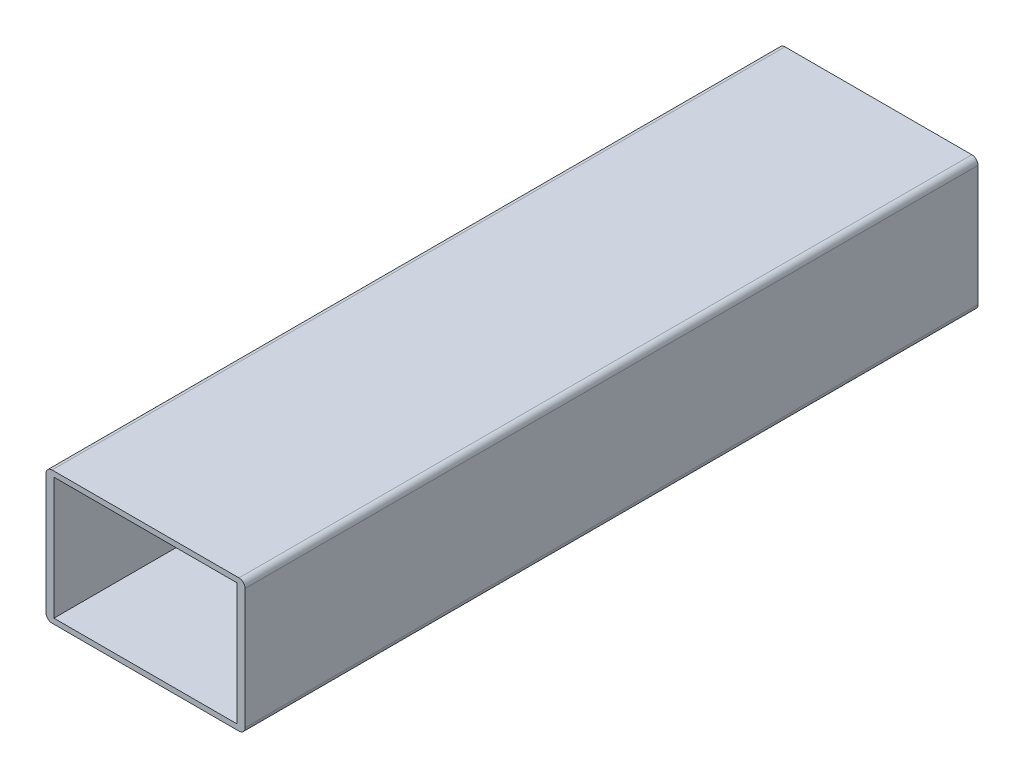
ISO-10303-21;
HEADER;
FILE_DESCRIPTION(('STEP AP214'),'2;1');
FILE_NAME('part.step','',(''),(''),'','','');
FILE_SCHEMA(('AUTOMOTIVE_DESIGN { 1 0 10303 214 1 1 1 1 }'));
ENDSEC;
DATA;
#1=APPLICATION_CONTEXT('core data for automotive mechanical design processes');
#2=APPLICATION_PROTOCOL_DEFINITION('international standard','automotive_design',2000,#1);
#3=PRODUCT_CONTEXT('',#1,'mechanical');
#4=PRODUCT('Part','Part','',(#3));
#5=PRODUCT_RELATED_PRODUCT_CATEGORY('part','',(#4));
#6=PRODUCT_DEFINITION_FORMATION('','',#4);
#7=PRODUCT_DEFINITION_CONTEXT('part definition',#1,'design');
#8=PRODUCT_DEFINITION('design','',#6,#7);
#9=PRODUCT_DEFINITION_SHAPE('','',#8);
#10=(LENGTH_UNIT() NAMED_UNIT(*) SI_UNIT(.MILLI.,.METRE.));
#11=(NAMED_UNIT(*) PLANE_ANGLE_UNIT() SI_UNIT($,.RADIAN.));
#12=(NAMED_UNIT(*) SI_UNIT($,.STERADIAN.) SOLID_ANGLE_UNIT());
#13=UNCERTAINTY_MEASURE_WITH_UNIT(LENGTH_MEASURE(1.E-05),#10,'distance_accuracy_value','');
#14=(GEOMETRIC_REPRESENTATION_CONTEXT(3) GLOBAL_UNCERTAINTY_ASSIGNED_CONTEXT((#13)) GLOBAL_UNIT_ASSIGNED_CONTEXT((#10,
#11,#12)) REPRESENTATION_CONTEXT('',''));
#15=CARTESIAN_POINT('',(0.,0.,0.));
#16=DIRECTION('',(0.,0.,1.));
#17=DIRECTION('',(1.,0.,0.));
#18=AXIS2_PLACEMENT_3D('',#15,#16,#17);
#19=CARTESIAN_POINT('',(-19.431,12.5306666666667,152.4));
#20=DIRECTION('',(0.,0.,1.));
#21=DIRECTION('',(1.,0.,0.));
#22=AXIS2_PLACEMENT_3D('',#19,#20,#21);
#23=PLANE('',#22);
#24=CARTESIAN_POINT('',(-19.431,12.5306666666667,152.4));
#25=DIRECTION('',(0.,0.,1.));
#26=DIRECTION('',(1.,0.,0.));
#27=AXIS2_PLACEMENT_3D('',#24,#25,#26);
#28=CIRCLE('',#27,1.27);
#29=CARTESIAN_POINT('',(-19.431,13.8006666666667,152.4));
#30=VERTEX_POINT('',#29);
#31=CARTESIAN_POINT('',(-20.701,12.5306666666667,152.4));
#32=VERTEX_POINT('',#31);
#33=EDGE_CURVE('E157',#30,#32,#28,.T.);
#34=ORIENTED_EDGE('',*,*,#33,.T.);
#35=DIRECTION('',(0.,-1.,0.));
#36=VECTOR('',#35,1.);
#37=CARTESIAN_POINT('',(-20.701,-12.5306666666667,152.4));
#38=LINE('',#37,#36);
#39=CARTESIAN_POINT('',(-20.701,-12.5306666666667,152.4));
#40=VERTEX_POINT('',#39);
#41=EDGE_CURVE('E160',#32,#40,#38,.T.);
#42=ORIENTED_EDGE('',*,*,#41,.T.);
#43=CARTESIAN_POINT('',(-19.431,-12.5306666666667,152.4));
#44=DIRECTION('',(0.,0.,1.));
#45=DIRECTION('',(1.,0.,0.));
#46=AXIS2_PLACEMENT_3D('',#43,#44,#45);
#47=CIRCLE('',#46,1.27);
#48=CARTESIAN_POINT('',(-19.431,-13.8006666666667,152.4));
#49=VERTEX_POINT('',#48);
#50=EDGE_CURVE('E163',#40,#49,#47,.T.);
#51=ORIENTED_EDGE('',*,*,#50,.T.);
#52=DIRECTION('',(1.,0.,0.));
#53=VECTOR('',#52,1.);
#54=CARTESIAN_POINT('',(19.431,-13.8006666666667,152.4));
#55=LINE('',#54,#53);
#56=CARTESIAN_POINT('',(19.431,-13.8006666666667,152.4));
#57=VERTEX_POINT('',#56);
#58=EDGE_CURVE('E165',#49,#57,#55,.T.);
#59=ORIENTED_EDGE('',*,*,#58,.T.);
#60=CARTESIAN_POINT('',(19.431,-12.5306666666667,152.4));
#61=DIRECTION('',(0.,0.,1.));
#62=DIRECTION('',(1.,0.,0.));
#63=AXIS2_PLACEMENT_3D('',#60,#61,#62);
#64=CIRCLE('',#63,1.27);
#65=CARTESIAN_POINT('',(20.701,-12.5306666666667,152.4));
#66=VERTEX_POINT('',#65);
#67=EDGE_CURVE('E167',#57,#66,#64,.T.);
#68=ORIENTED_EDGE('',*,*,#67,.T.);
#69=DIRECTION('',(0.,1.,0.));
#70=VECTOR('',#69,1.);
#71=CARTESIAN_POINT('',(20.701,-12.5306666666667,152.4));
#72=LINE('',#71,#70);
#73=CARTESIAN_POINT('',(20.701,12.5306666666667,152.4));
#74=VERTEX_POINT('',#73);
#75=EDGE_CURVE('E169',#66,#74,#72,.T.);
#76=ORIENTED_EDGE('',*,*,#75,.T.);
#77=CARTESIAN_POINT('',(19.431,12.5306666666667,152.4));
#78=DIRECTION('',(0.,0.,1.));
#79=DIRECTION('',(1.,0.,0.));
#80=AXIS2_PLACEMENT_3D('',#77,#78,#79);
#81=CIRCLE('',#80,1.27);
#82=CARTESIAN_POINT('',(19.431,13.8006666666667,152.4));
#83=VERTEX_POINT('',#82);
#84=EDGE_CURVE('E171',#74,#83,#81,.T.);
#85=ORIENTED_EDGE('',*,*,#84,.T.);
#86=DIRECTION('',(-1.,0.,0.));
#87=VECTOR('',#86,1.);
#88=CARTESIAN_POINT('',(19.431,13.8006666666667,152.4));
#89=LINE('',#88,#87);
#90=EDGE_CURVE('E173',#83,#30,#89,.T.);
#91=ORIENTED_EDGE('',*,*,#90,.T.);
#92=EDGE_LOOP('',(#34,#42,#51,#59,#68,#76,#85,#91));
#93=FACE_BOUND('',#92,.T.);
#94=DIRECTION('',(1.,0.,0.));
#95=VECTOR('',#94,1.);
#96=CARTESIAN_POINT('',(19.05,-12.7,152.4));
#97=LINE('',#96,#95);
#98=CARTESIAN_POINT('',(-19.05,-12.7,152.4));
#99=VERTEX_POINT('',#98);
#100=CARTESIAN_POINT('',(19.05,-12.7,152.4));
#101=VERTEX_POINT('',#100);
#102=EDGE_CURVE('E129',#99,#101,#97,.T.);
#103=ORIENTED_EDGE('',*,*,#102,.F.);
#104=DIRECTION('',(0.,-1.,0.));
#105=VECTOR('',#104,1.);
#106=CARTESIAN_POINT('',(-19.05,-12.7,152.4));
#107=LINE('',#106,#105);
#108=CARTESIAN_POINT('',(-19.05,12.7,152.4));
#109=VERTEX_POINT('',#108);
#110=EDGE_CURVE('E121',#109,#99,#107,.T.);
#111=ORIENTED_EDGE('',*,*,#110,.F.);
#112=DIRECTION('',(-1.,0.,0.));
#113=VECTOR('',#112,1.);
#114=CARTESIAN_POINT('',(19.05,12.7,152.4));
#115=LINE('',#114,#113);
#116=CARTESIAN_POINT('',(19.05,12.7,152.4));
#117=VERTEX_POINT('',#116);
#118=EDGE_CURVE('E143',#117,#109,#115,.T.);
#119=ORIENTED_EDGE('',*,*,#118,.F.);
#120=DIRECTION('',(0.,1.,0.));
#121=VECTOR('',#120,1.);
#122=CARTESIAN_POINT('',(19.05,-12.7,152.4));
#123=LINE('',#122,#121);
#124=EDGE_CURVE('E141',#101,#117,#123,.T.);
#125=ORIENTED_EDGE('',*,*,#124,.F.);
#126=EDGE_LOOP('',(#103,#111,#119,#125));
#127=FACE_BOUND('',#126,.T.);
#128=ADVANCED_FACE('F32',(#93,#127),#23,.T.);
#129=CARTESIAN_POINT('',(-19.431,12.5306666666667,0.));
#130=DIRECTION('',(0.,0.,1.));
#131=DIRECTION('',(1.,0.,0.));
#132=AXIS2_PLACEMENT_3D('',#129,#130,#131);
#133=PLANE('',#132);
#134=CARTESIAN_POINT('',(-19.431,12.5306666666667,0.));
#135=DIRECTION('',(0.,0.,1.));
#136=DIRECTION('',(1.,0.,0.));
#137=AXIS2_PLACEMENT_3D('',#134,#135,#136);
#138=CIRCLE('',#137,1.27);
#139=CARTESIAN_POINT('',(-19.431,13.8006666666667,0.));
#140=VERTEX_POINT('',#139);
#141=CARTESIAN_POINT('',(-20.701,12.5306666666667,0.));
#142=VERTEX_POINT('',#141);
#143=EDGE_CURVE('E137',#140,#142,#138,.T.);
#144=ORIENTED_EDGE('',*,*,#143,.F.);
#145=DIRECTION('',(-1.,0.,0.));
#146=VECTOR('',#145,1.);
#147=CARTESIAN_POINT('',(19.431,13.8006666666667,0.));
#148=LINE('',#147,#146);
#149=CARTESIAN_POINT('',(19.431,13.8006666666667,0.));
#150=VERTEX_POINT('',#149);
#151=EDGE_CURVE('E161',#150,#140,#148,.T.);
#152=ORIENTED_EDGE('',*,*,#151,.F.);
#153=CARTESIAN_POINT('',(19.431,12.5306666666667,0.));
#154=DIRECTION('',(0.,0.,1.));
#155=DIRECTION('',(1.,0.,0.));
#156=AXIS2_PLACEMENT_3D('',#153,#154,#155);
#157=CIRCLE('',#156,1.27);
#158=CARTESIAN_POINT('',(20.701,12.5306666666667,0.));
#159=VERTEX_POINT('',#158);
#160=EDGE_CURVE('E188',#159,#150,#157,.T.);
#161=ORIENTED_EDGE('',*,*,#160,.F.);
#162=DIRECTION('',(0.,1.,0.));
#163=VECTOR('',#162,1.);
#164=CARTESIAN_POINT('',(20.701,-12.5306666666667,0.));
#165=LINE('',#164,#163);
#166=CARTESIAN_POINT('',(20.701,-12.5306666666667,0.));
#167=VERTEX_POINT('',#166);
#168=EDGE_CURVE('E186',#167,#159,#165,.T.);
#169=ORIENTED_EDGE('',*,*,#168,.F.);
#170=CARTESIAN_POINT('',(19.431,-12.5306666666667,0.));
#171=DIRECTION('',(0.,0.,1.));
#172=DIRECTION('',(1.,0.,0.));
#173=AXIS2_PLACEMENT_3D('',#170,#171,#172);
#174=CIRCLE('',#173,1.27);
#175=CARTESIAN_POINT('',(19.431,-13.8006666666667,0.));
#176=VERTEX_POINT('',#175);
#177=EDGE_CURVE('E184',#176,#167,#174,.T.);
#178=ORIENTED_EDGE('',*,*,#177,.F.);
#179=DIRECTION('',(1.,0.,0.));
#180=VECTOR('',#179,1.);
#181=CARTESIAN_POINT('',(19.431,-13.8006666666667,0.));
#182=LINE('',#181,#180);
#183=CARTESIAN_POINT('',(-19.431,-13.8006666666667,0.));
#184=VERTEX_POINT('',#183);
#185=EDGE_CURVE('E182',#184,#176,#182,.T.);
#186=ORIENTED_EDGE('',*,*,#185,.F.);
#187=CARTESIAN_POINT('',(-19.431,-12.5306666666667,0.));
#188=DIRECTION('',(0.,0.,1.));
#189=DIRECTION('',(1.,0.,0.));
#190=AXIS2_PLACEMENT_3D('',#187,#188,#189);
#191=CIRCLE('',#190,1.27);
#192=CARTESIAN_POINT('',(-20.701,-12.5306666666667,0.));
#193=VERTEX_POINT('',#192);
#194=EDGE_CURVE('E180',#193,#184,#191,.T.);
#195=ORIENTED_EDGE('',*,*,#194,.F.);
#196=DIRECTION('',(0.,-1.,0.));
#197=VECTOR('',#196,1.);
#198=CARTESIAN_POINT('',(-20.701,-12.5306666666667,0.));
#199=LINE('',#198,#197);
#200=EDGE_CURVE('E178',#142,#193,#199,.T.);
#201=ORIENTED_EDGE('',*,*,#200,.F.);
#202=EDGE_LOOP('',(#144,#152,#161,#169,#178,#186,#195,#201));
#203=FACE_BOUND('',#202,.T.);
#204=DIRECTION('',(0.,-1.,0.));
#205=VECTOR('',#204,1.);
#206=CARTESIAN_POINT('',(-19.05,-12.7,0.));
#207=LINE('',#206,#205);
#208=CARTESIAN_POINT('',(-19.05,12.7,0.));
#209=VERTEX_POINT('',#208);
#210=CARTESIAN_POINT('',(-19.05,-12.7,0.));
#211=VERTEX_POINT('',#210);
#212=EDGE_CURVE('E55',#209,#211,#207,.T.);
#213=ORIENTED_EDGE('',*,*,#212,.T.);
#214=DIRECTION('',(1.,0.,0.));
#215=VECTOR('',#214,1.);
#216=CARTESIAN_POINT('',(19.05,-12.7,0.));
#217=LINE('',#216,#215);
#218=CARTESIAN_POINT('',(19.05,-12.7,0.));
#219=VERTEX_POINT('',#218);
#220=EDGE_CURVE('E136',#211,#219,#217,.T.);
#221=ORIENTED_EDGE('',*,*,#220,.T.);
#222=DIRECTION('',(0.,1.,0.));
#223=VECTOR('',#222,1.);
#224=CARTESIAN_POINT('',(19.05,-12.7,0.));
#225=LINE('',#224,#223);
#226=CARTESIAN_POINT('',(19.05,12.7,0.));
#227=VERTEX_POINT('',#226);
#228=EDGE_CURVE('E149',#219,#227,#225,.T.);
#229=ORIENTED_EDGE('',*,*,#228,.T.);
#230=DIRECTION('',(-1.,0.,0.));
#231=VECTOR('',#230,1.);
#232=CARTESIAN_POINT('',(19.05,12.7,0.));
#233=LINE('',#232,#231);
#234=EDGE_CURVE('E130',#227,#209,#233,.T.);
#235=ORIENTED_EDGE('',*,*,#234,.T.);
#236=EDGE_LOOP('',(#213,#221,#229,#235));
#237=FACE_BOUND('',#236,.T.);
#238=ADVANCED_FACE('F218',(#203,#237),#133,.F.);
#239=CARTESIAN_POINT('',(-19.431,12.5306666666667,152.4));
#240=DIRECTION('',(0.,0.,-1.));
#241=DIRECTION('',(-1.,0.,0.));
#242=AXIS2_PLACEMENT_3D('',#239,#240,#241);
#243=CYLINDRICAL_SURFACE('',#242,1.27);
#244=ORIENTED_EDGE('',*,*,#143,.T.);
#245=DIRECTION('',(0.,0.,-1.));
#246=VECTOR('',#245,1.);
#247=CARTESIAN_POINT('',(-20.701,12.5306666666667,152.4));
#248=LINE('',#247,#246);
#249=EDGE_CURVE('E11',#32,#142,#248,.T.);
#250=ORIENTED_EDGE('',*,*,#249,.F.);
#251=ORIENTED_EDGE('',*,*,#33,.F.);
#252=DIRECTION('',(0.,0.,-1.));
#253=VECTOR('',#252,1.);
#254=CARTESIAN_POINT('',(-19.431,13.8006666666667,152.4));
#255=LINE('',#254,#253);
#256=EDGE_CURVE('E175',#30,#140,#255,.T.);
#257=ORIENTED_EDGE('',*,*,#256,.T.);
#258=EDGE_LOOP('',(#244,#250,#251,#257));
#259=FACE_BOUND('',#258,.T.);
#260=ADVANCED_FACE('F34',(#259),#243,.T.);
#261=CARTESIAN_POINT('',(-20.701,-12.5306666666667,152.4));
#262=DIRECTION('',(1.,0.,0.));
#263=DIRECTION('',(0.,0.,-1.));
#264=AXIS2_PLACEMENT_3D('',#261,#262,#263);
#265=PLANE('',#264);
#266=ORIENTED_EDGE('',*,*,#200,.T.);
#267=DIRECTION('',(0.,0.,-1.));
#268=VECTOR('',#267,1.);
#269=CARTESIAN_POINT('',(-20.701,-12.5306666666667,152.4));
#270=LINE('',#269,#268);
#271=EDGE_CURVE('E40',#40,#193,#270,.T.);
#272=ORIENTED_EDGE('',*,*,#271,.F.);
#273=ORIENTED_EDGE('',*,*,#41,.F.);
#274=ORIENTED_EDGE('',*,*,#249,.T.);
#275=EDGE_LOOP('',(#266,#272,#273,#274));
#276=FACE_BOUND('',#275,.T.);
#277=ADVANCED_FACE('F235',(#276),#265,.F.);
#278=CARTESIAN_POINT('',(-19.431,-12.5306666666667,152.4));
#279=DIRECTION('',(0.,0.,-1.));
#280=DIRECTION('',(-1.,0.,0.));
#281=AXIS2_PLACEMENT_3D('',#278,#279,#280);
#282=CYLINDRICAL_SURFACE('',#281,1.27);
#283=ORIENTED_EDGE('',*,*,#194,.T.);
#284=DIRECTION('',(0.,0.,-1.));
#285=VECTOR('',#284,1.);
#286=CARTESIAN_POINT('',(-19.431,-13.8006666666667,152.4));
#287=LINE('',#286,#285);
#288=EDGE_CURVE('E205',#49,#184,#287,.T.);
#289=ORIENTED_EDGE('',*,*,#288,.F.);
#290=ORIENTED_EDGE('',*,*,#50,.F.);
#291=ORIENTED_EDGE('',*,*,#271,.T.);
#292=EDGE_LOOP('',(#283,#289,#290,#291));
#293=FACE_BOUND('',#292,.T.);
#294=ADVANCED_FACE('F212',(#293),#282,.T.);
#295=CARTESIAN_POINT('',(19.431,-13.8006666666667,152.4));
#296=DIRECTION('',(0.,1.,0.));
#297=DIRECTION('',(0.,0.,1.));
#298=AXIS2_PLACEMENT_3D('',#295,#296,#297);
#299=PLANE('',#298);
#300=ORIENTED_EDGE('',*,*,#185,.T.);
#301=DIRECTION('',(0.,0.,-1.));
#302=VECTOR('',#301,1.);
#303=CARTESIAN_POINT('',(19.431,-13.8006666666667,152.4));
#304=LINE('',#303,#302);
#305=EDGE_CURVE('E202',#57,#176,#304,.T.);
#306=ORIENTED_EDGE('',*,*,#305,.F.);
#307=ORIENTED_EDGE('',*,*,#58,.F.);
#308=ORIENTED_EDGE('',*,*,#288,.T.);
#309=EDGE_LOOP('',(#300,#306,#307,#308));
#310=FACE_BOUND('',#309,.T.);
#311=ADVANCED_FACE('F224',(#310),#299,.F.);
#312=CARTESIAN_POINT('',(19.431,-12.5306666666667,152.4));
#313=DIRECTION('',(0.,0.,-1.));
#314=DIRECTION('',(-1.,0.,0.));
#315=AXIS2_PLACEMENT_3D('',#312,#313,#314);
#316=CYLINDRICAL_SURFACE('',#315,1.27);
#317=ORIENTED_EDGE('',*,*,#177,.T.);
#318=DIRECTION('',(0.,0.,-1.));
#319=VECTOR('',#318,1.);
#320=CARTESIAN_POINT('',(20.701,-12.5306666666667,152.4));
#321=LINE('',#320,#319);
#322=EDGE_CURVE('E199',#66,#167,#321,.T.);
#323=ORIENTED_EDGE('',*,*,#322,.F.);
#324=ORIENTED_EDGE('',*,*,#67,.F.);
#325=ORIENTED_EDGE('',*,*,#305,.T.);
#326=EDGE_LOOP('',(#317,#323,#324,#325));
#327=FACE_BOUND('',#326,.T.);
#328=ADVANCED_FACE('F228',(#327),#316,.T.);
#329=CARTESIAN_POINT('',(20.701,-12.5306666666667,152.4));
#330=DIRECTION('',(-1.,0.,0.));
#331=DIRECTION('',(0.,0.,1.));
#332=AXIS2_PLACEMENT_3D('',#329,#330,#331);
#333=PLANE('',#332);
#334=ORIENTED_EDGE('',*,*,#168,.T.);
#335=DIRECTION('',(0.,0.,-1.));
#336=VECTOR('',#335,1.);
#337=CARTESIAN_POINT('',(20.701,12.5306666666667,152.4));
#338=LINE('',#337,#336);
#339=EDGE_CURVE('E196',#74,#159,#338,.T.);
#340=ORIENTED_EDGE('',*,*,#339,.F.);
#341=ORIENTED_EDGE('',*,*,#75,.F.);
#342=ORIENTED_EDGE('',*,*,#322,.T.);
#343=EDGE_LOOP('',(#334,#340,#341,#342));
#344=FACE_BOUND('',#343,.T.);
#345=ADVANCED_FACE('F248',(#344),#333,.F.);
#346=CARTESIAN_POINT('',(19.431,12.5306666666667,152.4));
#347=DIRECTION('',(0.,0.,-1.));
#348=DIRECTION('',(-1.,0.,0.));
#349=AXIS2_PLACEMENT_3D('',#346,#347,#348);
#350=CYLINDRICAL_SURFACE('',#349,1.27);
#351=ORIENTED_EDGE('',*,*,#160,.T.);
#352=DIRECTION('',(0.,0.,-1.));
#353=VECTOR('',#352,1.);
#354=CARTESIAN_POINT('',(19.431,13.8006666666667,152.4));
#355=LINE('',#354,#353);
#356=EDGE_CURVE('E193',#83,#150,#355,.T.);
#357=ORIENTED_EDGE('',*,*,#356,.F.);
#358=ORIENTED_EDGE('',*,*,#84,.F.);
#359=ORIENTED_EDGE('',*,*,#339,.T.);
#360=EDGE_LOOP('',(#351,#357,#358,#359));
#361=FACE_BOUND('',#360,.T.);
#362=ADVANCED_FACE('F246',(#361),#350,.T.);
#363=CARTESIAN_POINT('',(19.431,13.8006666666667,152.4));
#364=DIRECTION('',(0.,-1.,0.));
#365=DIRECTION('',(0.,0.,-1.));
#366=AXIS2_PLACEMENT_3D('',#363,#364,#365);
#367=PLANE('',#366);
#368=ORIENTED_EDGE('',*,*,#151,.T.);
#369=ORIENTED_EDGE('',*,*,#256,.F.);
#370=ORIENTED_EDGE('',*,*,#90,.F.);
#371=ORIENTED_EDGE('',*,*,#356,.T.);
#372=EDGE_LOOP('',(#368,#369,#370,#371));
#373=FACE_BOUND('',#372,.T.);
#374=ADVANCED_FACE('F241',(#373),#367,.F.);
#375=CARTESIAN_POINT('',(-19.05,-12.7,152.4));
#376=DIRECTION('',(1.,0.,0.));
#377=DIRECTION('',(0.,0.,-1.));
#378=AXIS2_PLACEMENT_3D('',#375,#376,#377);
#379=PLANE('',#378);
#380=ORIENTED_EDGE('',*,*,#212,.F.);
#381=DIRECTION('',(0.,0.,-1.));
#382=VECTOR('',#381,1.);
#383=CARTESIAN_POINT('',(-19.05,12.7,152.4));
#384=LINE('',#383,#382);
#385=EDGE_CURVE('E125',#109,#209,#384,.T.);
#386=ORIENTED_EDGE('',*,*,#385,.F.);
#387=ORIENTED_EDGE('',*,*,#110,.T.);
#388=DIRECTION('',(0.,0.,-1.));
#389=VECTOR('',#388,1.);
#390=CARTESIAN_POINT('',(-19.05,-12.7,152.4));
#391=LINE('',#390,#389);
#392=EDGE_CURVE('E124',#99,#211,#391,.T.);
#393=ORIENTED_EDGE('',*,*,#392,.T.);
#394=EDGE_LOOP('',(#380,#386,#387,#393));
#395=FACE_BOUND('',#394,.T.);
#396=ADVANCED_FACE('F123',(#395),#379,.T.);
#397=CARTESIAN_POINT('',(19.05,-12.7,152.4));
#398=DIRECTION('',(0.,1.,0.));
#399=DIRECTION('',(0.,0.,1.));
#400=AXIS2_PLACEMENT_3D('',#397,#398,#399);
#401=PLANE('',#400);
#402=ORIENTED_EDGE('',*,*,#220,.F.);
#403=ORIENTED_EDGE('',*,*,#392,.F.);
#404=ORIENTED_EDGE('',*,*,#102,.T.);
#405=DIRECTION('',(0.,0.,-1.));
#406=VECTOR('',#405,1.);
#407=CARTESIAN_POINT('',(19.05,-12.7,152.4));
#408=LINE('',#407,#406);
#409=EDGE_CURVE('E138',#101,#219,#408,.T.);
#410=ORIENTED_EDGE('',*,*,#409,.T.);
#411=EDGE_LOOP('',(#402,#403,#404,#410));
#412=FACE_BOUND('',#411,.T.);
#413=ADVANCED_FACE('F133',(#412),#401,.T.);
#414=CARTESIAN_POINT('',(19.05,-12.7,152.4));
#415=DIRECTION('',(-1.,0.,0.));
#416=DIRECTION('',(0.,0.,1.));
#417=AXIS2_PLACEMENT_3D('',#414,#415,#416);
#418=PLANE('',#417);
#419=ORIENTED_EDGE('',*,*,#228,.F.);
#420=ORIENTED_EDGE('',*,*,#409,.F.);
#421=ORIENTED_EDGE('',*,*,#124,.T.);
#422=DIRECTION('',(0.,0.,-1.));
#423=VECTOR('',#422,1.);
#424=CARTESIAN_POINT('',(19.05,12.7,152.4));
#425=LINE('',#424,#423);
#426=EDGE_CURVE('E47',#117,#227,#425,.T.);
#427=ORIENTED_EDGE('',*,*,#426,.T.);
#428=EDGE_LOOP('',(#419,#420,#421,#427));
#429=FACE_BOUND('',#428,.T.);
#430=ADVANCED_FACE('F273',(#429),#418,.T.);
#431=CARTESIAN_POINT('',(19.05,12.7,152.4));
#432=DIRECTION('',(0.,-1.,0.));
#433=DIRECTION('',(0.,0.,-1.));
#434=AXIS2_PLACEMENT_3D('',#431,#432,#433);
#435=PLANE('',#434);
#436=ORIENTED_EDGE('',*,*,#234,.F.);
#437=ORIENTED_EDGE('',*,*,#426,.F.);
#438=ORIENTED_EDGE('',*,*,#118,.T.);
#439=ORIENTED_EDGE('',*,*,#385,.T.);
#440=EDGE_LOOP('',(#436,#437,#438,#439));
#441=FACE_BOUND('',#440,.T.);
#442=ADVANCED_FACE('F277',(#441),#435,.T.);
#443=CLOSED_SHELL('',(#128,#238,#260,#277,#294,#311,#328,#345,#362,#374,#396,#413,#430,#442));
#444=MANIFOLD_SOLID_BREP('B2',#443);
#445=ADVANCED_BREP_SHAPE_REPRESENTATION('',(#18,#444),#14);
#446=SHAPE_DEFINITION_REPRESENTATION(#9,#445);
ENDSEC;
END-ISO-10303-21;
